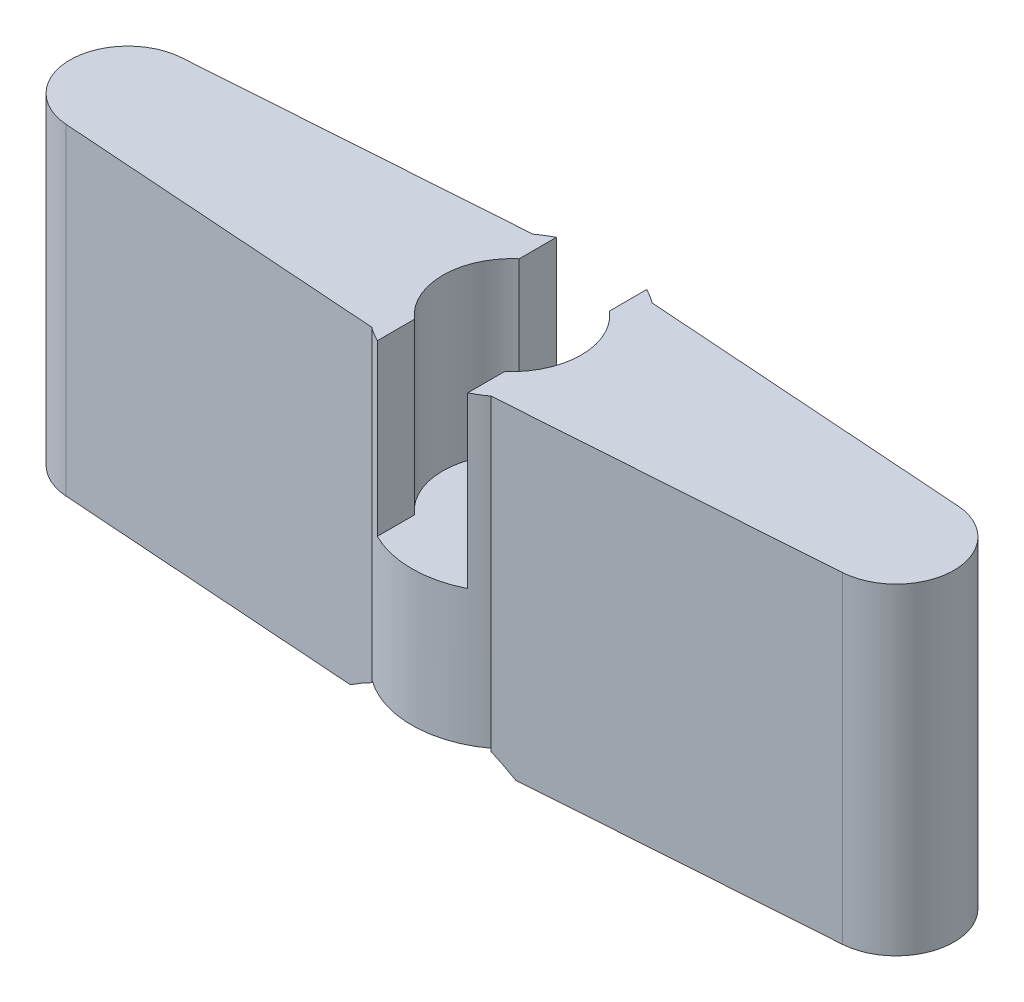
ISO-10303-21;
HEADER;
FILE_DESCRIPTION(('STEP AP214'),'2;1');
FILE_NAME('part.step','',(''),(''),'','','');
FILE_SCHEMA(('AUTOMOTIVE_DESIGN { 1 0 10303 214 1 1 1 1 }'));
ENDSEC;
DATA;
#1=APPLICATION_CONTEXT('core data for automotive mechanical design processes');
#2=APPLICATION_PROTOCOL_DEFINITION('international standard','automotive_design',2000,#1);
#3=PRODUCT_CONTEXT('',#1,'mechanical');
#4=PRODUCT('Part','Part','',(#3));
#5=PRODUCT_RELATED_PRODUCT_CATEGORY('part','',(#4));
#6=PRODUCT_DEFINITION_FORMATION('','',#4);
#7=PRODUCT_DEFINITION_CONTEXT('part definition',#1,'design');
#8=PRODUCT_DEFINITION('design','',#6,#7);
#9=PRODUCT_DEFINITION_SHAPE('','',#8);
#10=(LENGTH_UNIT() NAMED_UNIT(*) SI_UNIT(.MILLI.,.METRE.));
#11=(NAMED_UNIT(*) PLANE_ANGLE_UNIT() SI_UNIT($,.RADIAN.));
#12=(NAMED_UNIT(*) SI_UNIT($,.STERADIAN.) SOLID_ANGLE_UNIT());
#13=UNCERTAINTY_MEASURE_WITH_UNIT(LENGTH_MEASURE(1.E-05),#10,'distance_accuracy_value','');
#14=(GEOMETRIC_REPRESENTATION_CONTEXT(3) GLOBAL_UNCERTAINTY_ASSIGNED_CONTEXT((#13)) GLOBAL_UNIT_ASSIGNED_CONTEXT((#10,
#11,#12)) REPRESENTATION_CONTEXT('',''));
#15=CARTESIAN_POINT('',(0.,0.,0.));
#16=DIRECTION('',(0.,0.,1.));
#17=DIRECTION('',(1.,0.,0.));
#18=AXIS2_PLACEMENT_3D('',#15,#16,#17);
#19=CARTESIAN_POINT('',(-13.6,11.4,0.));
#20=DIRECTION('',(0.,-1.,0.));
#21=DIRECTION('',(0.,0.,-1.));
#22=AXIS2_PLACEMENT_3D('',#19,#20,#21);
#23=PLANE('',#22);
#24=CARTESIAN_POINT('',(0.,11.4,0.));
#25=DIRECTION('',(0.,1.,0.));
#26=DIRECTION('',(0.,0.,1.));
#27=AXIS2_PLACEMENT_3D('',#24,#25,#26);
#28=CIRCLE('',#27,3.55);
#29=CARTESIAN_POINT('',(-2.11206720067856,11.4,2.85336155084101));
#30=VERTEX_POINT('',#29);
#31=CARTESIAN_POINT('',(-1.6,11.4,3.16899037549817));
#32=VERTEX_POINT('',#31);
#33=EDGE_CURVE('E293',#30,#32,#28,.T.);
#34=ORIENTED_EDGE('',*,*,#33,.T.);
#35=DIRECTION('',(0.,0.,1.));
#36=VECTOR('',#35,1.);
#37=CARTESIAN_POINT('',(-1.6,11.4,5.45));
#38=LINE('',#37,#36);
#39=CARTESIAN_POINT('',(-1.6,11.4,1.85539753152795));
#40=VERTEX_POINT('',#39);
#41=EDGE_CURVE('E211',#40,#32,#38,.T.);
#42=ORIENTED_EDGE('',*,*,#41,.F.);
#43=CARTESIAN_POINT('',(0.,11.4,0.));
#44=DIRECTION('',(0.,1.,0.));
#45=DIRECTION('',(0.,0.,1.));
#46=AXIS2_PLACEMENT_3D('',#43,#44,#45);
#47=CIRCLE('',#46,2.45);
#48=CARTESIAN_POINT('',(-1.6,11.4,-1.85539753152795));
#49=VERTEX_POINT('',#48);
#50=EDGE_CURVE('E214',#49,#40,#47,.T.);
#51=ORIENTED_EDGE('',*,*,#50,.F.);
#52=DIRECTION('',(0.,0.,-1.));
#53=VECTOR('',#52,1.);
#54=CARTESIAN_POINT('',(-1.6,11.4,0.));
#55=LINE('',#54,#53);
#56=CARTESIAN_POINT('',(-1.6,11.4,-3.16899037549816));
#57=VERTEX_POINT('',#56);
#58=EDGE_CURVE('E58',#49,#57,#55,.T.);
#59=ORIENTED_EDGE('',*,*,#58,.T.);
#60=CARTESIAN_POINT('',(0.,11.4,0.));
#61=DIRECTION('',(0.,1.,0.));
#62=DIRECTION('',(0.,0.,1.));
#63=AXIS2_PLACEMENT_3D('',#60,#61,#62);
#64=CIRCLE('',#63,3.55);
#65=CARTESIAN_POINT('',(-2.11206720067856,11.4,-2.85336155084101));
#66=VERTEX_POINT('',#65);
#67=EDGE_CURVE('E306',#57,#66,#64,.T.);
#68=ORIENTED_EDGE('',*,*,#67,.T.);
#69=DIRECTION('',(-0.997593558445748,0.,0.0693331965767428));
#70=VECTOR('',#69,1.);
#71=CARTESIAN_POINT('',(-13.7421330529823,11.4,-2.04506679481378));
#72=LINE('',#71,#70);
#73=CARTESIAN_POINT('',(-13.7421330529823,11.4,-2.04506679481378));
#74=VERTEX_POINT('',#73);
#75=EDGE_CURVE('E311',#66,#74,#72,.T.);
#76=ORIENTED_EDGE('',*,*,#75,.T.);
#77=CARTESIAN_POINT('',(-13.6,11.4,0.));
#78=DIRECTION('',(0.,1.,0.));
#79=DIRECTION('',(0.,0.,-1.));
#80=AXIS2_PLACEMENT_3D('',#77,#78,#79);
#81=CIRCLE('',#80,2.05);
#82=CARTESIAN_POINT('',(-13.7421330529823,11.4,2.04506679481379));
#83=VERTEX_POINT('',#82);
#84=EDGE_CURVE('E284',#74,#83,#81,.T.);
#85=ORIENTED_EDGE('',*,*,#84,.T.);
#86=DIRECTION('',(0.997593558445748,0.,0.0693331965767427));
#87=VECTOR('',#86,1.);
#88=CARTESIAN_POINT('',(-13.7421330529823,11.4,2.04506679481379));
#89=LINE('',#88,#87);
#90=EDGE_CURVE('E288',#83,#30,#89,.T.);
#91=ORIENTED_EDGE('',*,*,#90,.T.);
#92=EDGE_LOOP('',(#34,#42,#51,#59,#68,#76,#85,#91));
#93=FACE_BOUND('',#92,.T.);
#94=ADVANCED_FACE('F47',(#93),#23,.F.);
#95=CARTESIAN_POINT('',(0.,11.4,0.));
#96=DIRECTION('',(0.,-1.,0.));
#97=DIRECTION('',(0.,0.,-1.));
#98=AXIS2_PLACEMENT_3D('',#95,#96,#97);
#99=CYLINDRICAL_SURFACE('',#98,3.55);
#100=CARTESIAN_POINT('',(1.6,11.4,3.16899037549817));
#101=VERTEX_POINT('',#100);
#102=CARTESIAN_POINT('',(2.11206720067856,11.4,2.85336155084101));
#103=VERTEX_POINT('',#102);
#104=EDGE_CURVE('E292',#101,#103,#28,.T.);
#105=ORIENTED_EDGE('',*,*,#104,.F.);
#106=DIRECTION('',(0.,-1.,0.));
#107=VECTOR('',#106,1.);
#108=CARTESIAN_POINT('',(1.6,11.4,3.16899037549817));
#109=LINE('',#108,#107);
#110=CARTESIAN_POINT('',(1.6,5.4,3.16899037549817));
#111=VERTEX_POINT('',#110);
#112=EDGE_CURVE('E256',#101,#111,#109,.T.);
#113=ORIENTED_EDGE('',*,*,#112,.T.);
#114=CARTESIAN_POINT('',(0.,5.4,0.));
#115=DIRECTION('',(0.,1.,0.));
#116=DIRECTION('',(0.,0.,1.));
#117=AXIS2_PLACEMENT_3D('',#114,#115,#116);
#118=CIRCLE('',#117,3.55);
#119=CARTESIAN_POINT('',(-1.6,5.4,3.16899037549817));
#120=VERTEX_POINT('',#119);
#121=EDGE_CURVE('E260',#120,#111,#118,.T.);
#122=ORIENTED_EDGE('',*,*,#121,.F.);
#123=DIRECTION('',(0.,-1.,0.));
#124=VECTOR('',#123,1.);
#125=CARTESIAN_POINT('',(-1.6,11.4,3.16899037549817));
#126=LINE('',#125,#124);
#127=EDGE_CURVE('E252',#120,#32,#126,.F.);
#128=ORIENTED_EDGE('',*,*,#127,.T.);
#129=ORIENTED_EDGE('',*,*,#33,.F.);
#130=DIRECTION('',(0.,-1.,0.));
#131=VECTOR('',#130,1.);
#132=CARTESIAN_POINT('',(-2.11206720067856,11.4,2.85336155084101));
#133=LINE('',#132,#131);
#134=CARTESIAN_POINT('',(-2.11206720067856,0.6,2.85336155084101));
#135=VERTEX_POINT('',#134);
#136=EDGE_CURVE('E356',#30,#135,#133,.T.);
#137=ORIENTED_EDGE('',*,*,#136,.T.);
#138=CARTESIAN_POINT('',(0.,0.6,0.));
#139=DIRECTION('',(0.,-1.,0.));
#140=DIRECTION('',(0.,0.,-1.));
#141=AXIS2_PLACEMENT_3D('',#138,#139,#140);
#142=CIRCLE('',#141,3.55);
#143=CARTESIAN_POINT('',(2.11206720067856,0.6,2.85336155084101));
#144=VERTEX_POINT('',#143);
#145=EDGE_CURVE('E269',#144,#135,#142,.T.);
#146=ORIENTED_EDGE('',*,*,#145,.F.);
#147=DIRECTION('',(0.,-1.,0.));
#148=VECTOR('',#147,1.);
#149=CARTESIAN_POINT('',(2.11206720067856,11.4,2.85336155084101));
#150=LINE('',#149,#148);
#151=EDGE_CURVE('E352',#103,#144,#150,.T.);
#152=ORIENTED_EDGE('',*,*,#151,.F.);
#153=EDGE_LOOP('',(#105,#113,#122,#128,#129,#137,#146,#152));
#154=FACE_BOUND('',#153,.T.);
#155=ADVANCED_FACE('F391',(#154),#99,.T.);
#156=CARTESIAN_POINT('',(0.,11.4,0.));
#157=DIRECTION('',(0.,-1.,0.));
#158=DIRECTION('',(0.,0.,-1.));
#159=AXIS2_PLACEMENT_3D('',#156,#157,#158);
#160=CYLINDRICAL_SURFACE('',#159,3.55);
#161=ORIENTED_EDGE('',*,*,#67,.F.);
#162=DIRECTION('',(0.,-1.,0.));
#163=VECTOR('',#162,1.);
#164=CARTESIAN_POINT('',(-1.6,11.4,-3.16899037549816));
#165=LINE('',#164,#163);
#166=CARTESIAN_POINT('',(-1.6,5.4,-3.16899037549816));
#167=VERTEX_POINT('',#166);
#168=EDGE_CURVE('E248',#57,#167,#165,.T.);
#169=ORIENTED_EDGE('',*,*,#168,.T.);
#170=CARTESIAN_POINT('',(0.,5.4,0.));
#171=DIRECTION('',(0.,1.,0.));
#172=DIRECTION('',(0.,0.,1.));
#173=AXIS2_PLACEMENT_3D('',#170,#171,#172);
#174=CIRCLE('',#173,3.55);
#175=CARTESIAN_POINT('',(1.6,5.4,-3.16899037549817));
#176=VERTEX_POINT('',#175);
#177=EDGE_CURVE('E11',#176,#167,#174,.T.);
#178=ORIENTED_EDGE('',*,*,#177,.F.);
#179=DIRECTION('',(0.,-1.,0.));
#180=VECTOR('',#179,1.);
#181=CARTESIAN_POINT('',(1.6,11.4,-3.16899037549817));
#182=LINE('',#181,#180);
#183=CARTESIAN_POINT('',(1.6,11.4,-3.16899037549817));
#184=VERTEX_POINT('',#183);
#185=EDGE_CURVE('E201',#176,#184,#182,.F.);
#186=ORIENTED_EDGE('',*,*,#185,.T.);
#187=CARTESIAN_POINT('',(2.11206720067856,11.4,-2.85336155084101));
#188=VERTEX_POINT('',#187);
#189=EDGE_CURVE('E307',#188,#184,#64,.T.);
#190=ORIENTED_EDGE('',*,*,#189,.F.);
#191=DIRECTION('',(0.,-1.,0.));
#192=VECTOR('',#191,1.);
#193=CARTESIAN_POINT('',(2.11206720067856,11.4,-2.85336155084101));
#194=LINE('',#193,#192);
#195=CARTESIAN_POINT('',(2.11206720067856,0.6,-2.85336155084101));
#196=VERTEX_POINT('',#195);
#197=EDGE_CURVE('E340',#188,#196,#194,.T.);
#198=ORIENTED_EDGE('',*,*,#197,.T.);
#199=CARTESIAN_POINT('',(-2.11206720067856,0.6,-2.85336155084101));
#200=VERTEX_POINT('',#199);
#201=EDGE_CURVE('E263',#200,#196,#142,.T.);
#202=ORIENTED_EDGE('',*,*,#201,.F.);
#203=DIRECTION('',(0.,-1.,0.));
#204=VECTOR('',#203,1.);
#205=CARTESIAN_POINT('',(-2.11206720067856,11.4,-2.85336155084101));
#206=LINE('',#205,#204);
#207=EDGE_CURVE('E336',#66,#200,#206,.T.);
#208=ORIENTED_EDGE('',*,*,#207,.F.);
#209=EDGE_LOOP('',(#161,#169,#178,#186,#190,#198,#202,#208));
#210=FACE_BOUND('',#209,.T.);
#211=ADVANCED_FACE('F394',(#210),#160,.T.);
#212=CARTESIAN_POINT('',(-13.6,0.,0.));
#213=DIRECTION('',(0.,-1.,0.));
#214=DIRECTION('',(0.,0.,-1.));
#215=AXIS2_PLACEMENT_3D('',#212,#213,#214);
#216=PLANE('',#215);
#217=DIRECTION('',(0.997593558445748,0.,-0.0693331965767425));
#218=VECTOR('',#217,1.);
#219=CARTESIAN_POINT('',(13.7421330529823,0.,2.04506679481379));
#220=LINE('',#219,#218);
#221=CARTESIAN_POINT('',(2.92947075894018,0.,2.79655163952224));
#222=VERTEX_POINT('',#221);
#223=CARTESIAN_POINT('',(13.7421330529823,0.,2.04506679481379));
#224=VERTEX_POINT('',#223);
#225=EDGE_CURVE('E321',#222,#224,#220,.T.);
#226=ORIENTED_EDGE('',*,*,#225,.F.);
#227=CARTESIAN_POINT('',(0.,0.,0.));
#228=DIRECTION('',(0.,-1.,0.));
#229=DIRECTION('',(0.,0.,-1.));
#230=AXIS2_PLACEMENT_3D('',#227,#228,#229);
#231=CIRCLE('',#230,4.05000000000001);
#232=CARTESIAN_POINT('',(2.92947075894018,0.,-2.79655163952224));
#233=VERTEX_POINT('',#232);
#234=EDGE_CURVE('E376',#222,#233,#231,.F.);
#235=ORIENTED_EDGE('',*,*,#234,.T.);
#236=DIRECTION('',(-0.997593558445748,0.,-0.0693331965767422));
#237=VECTOR('',#236,1.);
#238=CARTESIAN_POINT('',(13.7421330529823,0.,-2.04506679481379));
#239=LINE('',#238,#237);
#240=CARTESIAN_POINT('',(13.7421330529823,0.,-2.04506679481379));
#241=VERTEX_POINT('',#240);
#242=EDGE_CURVE('E327',#241,#233,#239,.T.);
#243=ORIENTED_EDGE('',*,*,#242,.F.);
#244=CARTESIAN_POINT('',(13.6,0.,0.));
#245=DIRECTION('',(0.,1.,0.));
#246=DIRECTION('',(0.,0.,1.));
#247=AXIS2_PLACEMENT_3D('',#244,#245,#246);
#248=CIRCLE('',#247,2.05000000000001);
#249=EDGE_CURVE('E324',#224,#241,#248,.T.);
#250=ORIENTED_EDGE('',*,*,#249,.F.);
#251=EDGE_LOOP('',(#226,#235,#243,#250));
#252=FACE_BOUND('',#251,.T.);
#253=ADVANCED_FACE('F470',(#252),#216,.T.);
#254=CARTESIAN_POINT('',(-13.6,11.4,0.));
#255=DIRECTION('',(0.,-1.,0.));
#256=DIRECTION('',(0.,0.,-1.));
#257=AXIS2_PLACEMENT_3D('',#254,#255,#256);
#258=CYLINDRICAL_SURFACE('',#257,2.05);
#259=CARTESIAN_POINT('',(-13.6,0.,0.));
#260=DIRECTION('',(0.,1.,0.));
#261=DIRECTION('',(0.,0.,-1.));
#262=AXIS2_PLACEMENT_3D('',#259,#260,#261);
#263=CIRCLE('',#262,2.05);
#264=CARTESIAN_POINT('',(-13.7421330529823,0.,-2.04506679481378));
#265=VERTEX_POINT('',#264);
#266=CARTESIAN_POINT('',(-13.7421330529823,0.,2.04506679481379));
#267=VERTEX_POINT('',#266);
#268=EDGE_CURVE('E283',#265,#267,#263,.T.);
#269=ORIENTED_EDGE('',*,*,#268,.T.);
#270=DIRECTION('',(0.,-1.,0.));
#271=VECTOR('',#270,1.);
#272=CARTESIAN_POINT('',(-13.7421330529823,11.4,2.04506679481379));
#273=LINE('',#272,#271);
#274=EDGE_CURVE('E360',#83,#267,#273,.T.);
#275=ORIENTED_EDGE('',*,*,#274,.F.);
#276=ORIENTED_EDGE('',*,*,#84,.F.);
#277=DIRECTION('',(0.,-1.,0.));
#278=VECTOR('',#277,1.);
#279=CARTESIAN_POINT('',(-13.7421330529823,11.4,-2.04506679481378));
#280=LINE('',#279,#278);
#281=EDGE_CURVE('E314',#74,#265,#280,.T.);
#282=ORIENTED_EDGE('',*,*,#281,.T.);
#283=EDGE_LOOP('',(#269,#275,#276,#282));
#284=FACE_BOUND('',#283,.T.);
#285=ADVANCED_FACE('F398',(#284),#258,.T.);
#286=CARTESIAN_POINT('',(-13.7421330529823,11.4,2.04506679481379));
#287=DIRECTION('',(0.0693331965767427,0.,-0.997593558445748));
#288=DIRECTION('',(-0.997593558445748,0.,-0.0693331965767427));
#289=AXIS2_PLACEMENT_3D('',#286,#287,#288);
#290=PLANE('',#289);
#291=DIRECTION('',(0.997593558445748,0.,0.0693331965767427));
#292=VECTOR('',#291,1.);
#293=CARTESIAN_POINT('',(-13.7421330529823,0.,2.04506679481379));
#294=LINE('',#293,#292);
#295=CARTESIAN_POINT('',(-2.92947075894019,0.,2.79655163952224));
#296=VERTEX_POINT('',#295);
#297=EDGE_CURVE('E318',#267,#296,#294,.T.);
#298=ORIENTED_EDGE('',*,*,#297,.T.);
#299=CARTESIAN_POINT('',(-2.92947075894018,0.,2.79655163952224));
#300=CARTESIAN_POINT('',(-2.86324704905432,0.0447155819520324,2.80115421685114));
#301=CARTESIAN_POINT('',(-2.79661425008659,0.0888313173042009,2.80578522605341));
#302=CARTESIAN_POINT('',(-2.66246979131271,0.175605977431229,2.81510832567761));
#303=CARTESIAN_POINT('',(-2.59495869203381,0.218265773901589,2.81980037714265));
#304=CARTESIAN_POINT('',(-2.4589080154176,0.301931709302118,2.8292559597558));
#305=CARTESIAN_POINT('',(-2.39036831150441,0.342937642386836,2.83401949970099));
#306=CARTESIAN_POINT('',(-2.25211578578016,0.423008838841666,2.84362811180771));
#307=CARTESIAN_POINT('',(-2.18240227306905,0.462072901679901,2.8484732319871));
#308=CARTESIAN_POINT('',(-2.11206720067856,0.50000000000001,2.85336155084101));
#309=B_SPLINE_CURVE_WITH_KNOTS('',3,(#299,#300,#301,#302,#303,#304,#305,#306,#307,#308),
.UNSPECIFIED.,.F.,.F.,(4,2,2,2,4),(0.,0.240120930713615,0.480095480675951,0.720099807089992,
0.960250712770563),.UNSPECIFIED.);
#310=CARTESIAN_POINT('',(-2.11206720067856,0.50000000000001,2.85336155084101));
#311=VERTEX_POINT('',#310);
#312=EDGE_CURVE('E401',#296,#311,#309,.T.);
#313=ORIENTED_EDGE('',*,*,#312,.T.);
#314=DIRECTION('',(0.,-1.,0.));
#315=VECTOR('',#314,1.);
#316=CARTESIAN_POINT('',(-2.11206720067856,0.6,2.85336155084101));
#317=LINE('',#316,#315);
#318=EDGE_CURVE('E280',#311,#135,#317,.F.);
#319=ORIENTED_EDGE('',*,*,#318,.T.);
#320=ORIENTED_EDGE('',*,*,#136,.F.);
#321=ORIENTED_EDGE('',*,*,#90,.F.);
#322=ORIENTED_EDGE('',*,*,#274,.T.);
#323=EDGE_LOOP('',(#298,#313,#319,#320,#321,#322));
#324=FACE_BOUND('',#323,.T.);
#325=ADVANCED_FACE('F388',(#324),#290,.F.);
#326=CARTESIAN_POINT('',(13.7421330529823,11.4,2.04506679481379));
#327=DIRECTION('',(-0.0693331965767425,0.,-0.997593558445748));
#328=DIRECTION('',(-0.997593558445748,0.,0.0693331965767425));
#329=AXIS2_PLACEMENT_3D('',#326,#327,#328);
#330=PLANE('',#329);
#331=DIRECTION('',(0.,-1.,0.));
#332=VECTOR('',#331,1.);
#333=CARTESIAN_POINT('',(2.11206720067856,0.6,2.85336155084101));
#334=LINE('',#333,#332);
#335=CARTESIAN_POINT('',(2.11206720067856,0.50000000000001,2.85336155084101));
#336=VERTEX_POINT('',#335);
#337=EDGE_CURVE('E276',#144,#336,#334,.T.);
#338=ORIENTED_EDGE('',*,*,#337,.T.);
#339=CARTESIAN_POINT('',(2.11206720067856,0.50000000000001,2.85336155084101));
#340=CARTESIAN_POINT('',(2.18240227306905,0.462072901679901,2.8484732319871));
#341=CARTESIAN_POINT('',(2.25211578578016,0.423008838841666,2.84362811180771));
#342=CARTESIAN_POINT('',(2.39036831150441,0.342937642386836,2.83401949970099));
#343=CARTESIAN_POINT('',(2.4589080154176,0.301931709302118,2.8292559597558));
#344=CARTESIAN_POINT('',(2.59495869203381,0.218265773901588,2.81980037714265));
#345=CARTESIAN_POINT('',(2.66246979131271,0.175605977431229,2.81510832567761));
#346=CARTESIAN_POINT('',(2.79661425008659,0.0888313173042005,2.80578522605341));
#347=CARTESIAN_POINT('',(2.86324704905432,0.0447155819520321,2.80115421685114));
#348=CARTESIAN_POINT('',(2.92947075894018,0.,2.79655163952224));
#349=B_SPLINE_CURVE_WITH_KNOTS('',3,(#339,#340,#341,#342,#343,#344,#345,#346,#347,#348),
.UNSPECIFIED.,.F.,.F.,(4,2,2,2,4),(0.,0.240150905680571,0.480155232094612,0.720129782056947,
0.960250712770562),.UNSPECIFIED.);
#350=EDGE_CURVE('E368',#336,#222,#349,.T.);
#351=ORIENTED_EDGE('',*,*,#350,.T.);
#352=ORIENTED_EDGE('',*,*,#225,.T.);
#353=DIRECTION('',(0.,-1.,0.));
#354=VECTOR('',#353,1.);
#355=CARTESIAN_POINT('',(13.7421330529823,11.4,2.04506679481379));
#356=LINE('',#355,#354);
#357=CARTESIAN_POINT('',(13.7421330529823,11.4,2.04506679481379));
#358=VERTEX_POINT('',#357);
#359=EDGE_CURVE('E348',#358,#224,#356,.T.);
#360=ORIENTED_EDGE('',*,*,#359,.F.);
#361=DIRECTION('',(0.997593558445748,0.,-0.0693331965767425));
#362=VECTOR('',#361,1.);
#363=CARTESIAN_POINT('',(13.7421330529823,11.4,2.04506679481379));
#364=LINE('',#363,#362);
#365=EDGE_CURVE('E297',#103,#358,#364,.T.);
#366=ORIENTED_EDGE('',*,*,#365,.F.);
#367=ORIENTED_EDGE('',*,*,#151,.T.);
#368=EDGE_LOOP('',(#338,#351,#352,#360,#366,#367));
#369=FACE_BOUND('',#368,.T.);
#370=ADVANCED_FACE('F382',(#369),#330,.F.);
#371=CARTESIAN_POINT('',(13.6,11.4,0.));
#372=DIRECTION('',(0.,-1.,0.));
#373=DIRECTION('',(0.,0.,-1.));
#374=AXIS2_PLACEMENT_3D('',#371,#372,#373);
#375=CYLINDRICAL_SURFACE('',#374,2.05000000000001);
#376=ORIENTED_EDGE('',*,*,#249,.T.);
#377=DIRECTION('',(0.,-1.,0.));
#378=VECTOR('',#377,1.);
#379=CARTESIAN_POINT('',(13.7421330529823,11.4,-2.04506679481379));
#380=LINE('',#379,#378);
#381=CARTESIAN_POINT('',(13.7421330529823,11.4,-2.04506679481379));
#382=VERTEX_POINT('',#381);
#383=EDGE_CURVE('E344',#382,#241,#380,.T.);
#384=ORIENTED_EDGE('',*,*,#383,.F.);
#385=CARTESIAN_POINT('',(13.6,11.4,0.));
#386=DIRECTION('',(0.,1.,0.));
#387=DIRECTION('',(0.,0.,1.));
#388=AXIS2_PLACEMENT_3D('',#385,#386,#387);
#389=CIRCLE('',#388,2.05000000000001);
#390=EDGE_CURVE('E300',#358,#382,#389,.T.);
#391=ORIENTED_EDGE('',*,*,#390,.F.);
#392=ORIENTED_EDGE('',*,*,#359,.T.);
#393=EDGE_LOOP('',(#376,#384,#391,#392));
#394=FACE_BOUND('',#393,.T.);
#395=ADVANCED_FACE('F387',(#394),#375,.T.);
#396=CARTESIAN_POINT('',(13.7421330529823,11.4,-2.04506679481379));
#397=DIRECTION('',(-0.0693331965767422,0.,0.997593558445748));
#398=DIRECTION('',(0.997593558445748,0.,0.0693331965767422));
#399=AXIS2_PLACEMENT_3D('',#396,#397,#398);
#400=PLANE('',#399);
#401=ORIENTED_EDGE('',*,*,#242,.T.);
#402=CARTESIAN_POINT('',(2.92947075894018,0.,-2.79655163952224));
#403=CARTESIAN_POINT('',(2.86324704905432,0.0447155819520325,-2.80115421685114));
#404=CARTESIAN_POINT('',(2.79661425008659,0.088831317304201,-2.80578522605341));
#405=CARTESIAN_POINT('',(2.66246979131271,0.175605977431229,-2.81510832567761));
#406=CARTESIAN_POINT('',(2.59495869203381,0.218265773901589,-2.81980037714265));
#407=CARTESIAN_POINT('',(2.4589080154176,0.301931709302118,-2.8292559597558));
#408=CARTESIAN_POINT('',(2.39036831150441,0.342937642386836,-2.83401949970099));
#409=CARTESIAN_POINT('',(2.25211578578016,0.423008838841666,-2.84362811180771));
#410=CARTESIAN_POINT('',(2.18240227306905,0.4620729016799,-2.8484732319871));
#411=CARTESIAN_POINT('',(2.11206720067856,0.500000000000009,-2.85336155084101));
#412=B_SPLINE_CURVE_WITH_KNOTS('',3,(#402,#403,#404,#405,#406,#407,#408,#409,#410,#411),
.UNSPECIFIED.,.F.,.F.,(4,2,2,2,4),(0.,0.240120930713614,0.48009548067595,0.72009980708999,
0.960250712770561),.UNSPECIFIED.);
#413=CARTESIAN_POINT('',(2.11206720067856,0.50000000000001,-2.85336155084101));
#414=VERTEX_POINT('',#413);
#415=EDGE_CURVE('E449',#233,#414,#412,.T.);
#416=ORIENTED_EDGE('',*,*,#415,.T.);
#417=DIRECTION('',(0.,-1.,0.));
#418=VECTOR('',#417,1.);
#419=CARTESIAN_POINT('',(2.11206720067856,0.6,-2.85336155084101));
#420=LINE('',#419,#418);
#421=EDGE_CURVE('E273',#414,#196,#420,.F.);
#422=ORIENTED_EDGE('',*,*,#421,.T.);
#423=ORIENTED_EDGE('',*,*,#197,.F.);
#424=DIRECTION('',(-0.997593558445748,0.,-0.0693331965767422));
#425=VECTOR('',#424,1.);
#426=CARTESIAN_POINT('',(13.7421330529823,11.4,-2.04506679481379));
#427=LINE('',#426,#425);
#428=EDGE_CURVE('E303',#382,#188,#427,.T.);
#429=ORIENTED_EDGE('',*,*,#428,.F.);
#430=ORIENTED_EDGE('',*,*,#383,.T.);
#431=EDGE_LOOP('',(#401,#416,#422,#423,#429,#430));
#432=FACE_BOUND('',#431,.T.);
#433=ADVANCED_FACE('F447',(#432),#400,.F.);
#434=CARTESIAN_POINT('',(-13.7421330529823,11.4,-2.04506679481378));
#435=DIRECTION('',(0.0693331965767428,0.,0.997593558445748));
#436=DIRECTION('',(0.997593558445748,0.,-0.0693331965767428));
#437=AXIS2_PLACEMENT_3D('',#434,#435,#436);
#438=PLANE('',#437);
#439=DIRECTION('',(0.,-1.,0.));
#440=VECTOR('',#439,1.);
#441=CARTESIAN_POINT('',(-2.11206720067856,0.6,-2.85336155084101));
#442=LINE('',#441,#440);
#443=CARTESIAN_POINT('',(-2.11206720067856,0.50000000000001,-2.85336155084101));
#444=VERTEX_POINT('',#443);
#445=EDGE_CURVE('E268',#200,#444,#442,.T.);
#446=ORIENTED_EDGE('',*,*,#445,.T.);
#447=CARTESIAN_POINT('',(-2.11206720067857,0.50000000000001,-2.85336155084101));
#448=CARTESIAN_POINT('',(-2.18240227306906,0.462072901679901,-2.8484732319871));
#449=CARTESIAN_POINT('',(-2.25211578578016,0.423008838841666,-2.84362811180771));
#450=CARTESIAN_POINT('',(-2.39036831150441,0.342937642386836,-2.83401949970099));
#451=CARTESIAN_POINT('',(-2.4589080154176,0.301931709302118,-2.82925595975579));
#452=CARTESIAN_POINT('',(-2.59495869203381,0.218265773901589,-2.81980037714264));
#453=CARTESIAN_POINT('',(-2.66246979131271,0.175605977431229,-2.81510832567761));
#454=CARTESIAN_POINT('',(-2.79661425008659,0.0888313173042004,-2.80578522605341));
#455=CARTESIAN_POINT('',(-2.86324704905432,0.0447155819520319,-2.80115421685114));
#456=CARTESIAN_POINT('',(-2.92947075894018,0.,-2.79655163952224));
#457=B_SPLINE_CURVE_WITH_KNOTS('',3,(#447,#448,#449,#450,#451,#452,#453,#454,#455,#456),
.UNSPECIFIED.,.F.,.F.,(4,2,2,2,4),(0.,0.240150905680571,0.480155232094612,0.720129782056948,
0.960250712770562),.UNSPECIFIED.);
#458=CARTESIAN_POINT('',(-2.92947075894019,0.,-2.79655163952224));
#459=VERTEX_POINT('',#458);
#460=EDGE_CURVE('E458',#444,#459,#457,.T.);
#461=ORIENTED_EDGE('',*,*,#460,.T.);
#462=DIRECTION('',(-0.997593558445748,0.,0.0693331965767428));
#463=VECTOR('',#462,1.);
#464=CARTESIAN_POINT('',(-13.7421330529823,0.,-2.04506679481378));
#465=LINE('',#464,#463);
#466=EDGE_CURVE('E289',#459,#265,#465,.T.);
#467=ORIENTED_EDGE('',*,*,#466,.T.);
#468=ORIENTED_EDGE('',*,*,#281,.F.);
#469=ORIENTED_EDGE('',*,*,#75,.F.);
#470=ORIENTED_EDGE('',*,*,#207,.T.);
#471=EDGE_LOOP('',(#446,#461,#467,#468,#469,#470));
#472=FACE_BOUND('',#471,.T.);
#473=ADVANCED_FACE('F467',(#472),#438,.F.);
#474=CARTESIAN_POINT('',(0.,11.4,0.));
#475=DIRECTION('',(0.,1.,0.));
#476=DIRECTION('',(0.,0.,1.));
#477=AXIS2_PLACEMENT_3D('',#474,#475,#476);
#478=CIRCLE('',#477,2.45);
#479=CARTESIAN_POINT('',(1.6,11.4,1.85539753152795));
#480=VERTEX_POINT('',#479);
#481=CARTESIAN_POINT('',(1.6,11.4,-1.85539753152795));
#482=VERTEX_POINT('',#481);
#483=EDGE_CURVE('E65',#480,#482,#478,.T.);
#484=ORIENTED_EDGE('',*,*,#483,.F.);
#485=DIRECTION('',(0.,0.,1.));
#486=VECTOR('',#485,1.);
#487=CARTESIAN_POINT('',(1.6,11.4,0.));
#488=LINE('',#487,#486);
#489=EDGE_CURVE('E409',#480,#101,#488,.T.);
#490=ORIENTED_EDGE('',*,*,#489,.T.);
#491=ORIENTED_EDGE('',*,*,#104,.T.);
#492=ORIENTED_EDGE('',*,*,#365,.T.);
#493=ORIENTED_EDGE('',*,*,#390,.T.);
#494=ORIENTED_EDGE('',*,*,#428,.T.);
#495=ORIENTED_EDGE('',*,*,#189,.T.);
#496=DIRECTION('',(0.,0.,-1.));
#497=VECTOR('',#496,1.);
#498=CARTESIAN_POINT('',(1.6,11.4,-1.85539753152795));
#499=LINE('',#498,#497);
#500=EDGE_CURVE('E231',#482,#184,#499,.T.);
#501=ORIENTED_EDGE('',*,*,#500,.F.);
#502=EDGE_LOOP('',(#484,#490,#491,#492,#493,#494,#495,#501));
#503=FACE_BOUND('',#502,.T.);
#504=ADVANCED_FACE('F474',(#503),#23,.F.);
#505=ORIENTED_EDGE('',*,*,#466,.F.);
#506=CARTESIAN_POINT('',(0.,0.,0.));
#507=DIRECTION('',(0.,-1.,0.));
#508=DIRECTION('',(0.,0.,-1.));
#509=AXIS2_PLACEMENT_3D('',#506,#507,#508);
#510=CIRCLE('',#509,4.05000000000001);
#511=EDGE_CURVE('E73',#459,#296,#510,.F.);
#512=ORIENTED_EDGE('',*,*,#511,.T.);
#513=ORIENTED_EDGE('',*,*,#297,.F.);
#514=ORIENTED_EDGE('',*,*,#268,.F.);
#515=EDGE_LOOP('',(#505,#512,#513,#514));
#516=FACE_BOUND('',#515,.T.);
#517=ADVANCED_FACE('F476',(#516),#216,.T.);
#518=CARTESIAN_POINT('',(0.,0.6,0.));
#519=DIRECTION('',(0.,-1.,0.));
#520=DIRECTION('',(0.,0.,-1.));
#521=AXIS2_PLACEMENT_3D('',#518,#519,#520);
#522=CYLINDRICAL_SURFACE('',#521,3.55);
#523=ORIENTED_EDGE('',*,*,#318,.F.);
#524=CARTESIAN_POINT('',(0.,0.50000000000001,0.));
#525=DIRECTION('',(0.,-1.,0.));
#526=DIRECTION('',(0.,0.,-1.));
#527=AXIS2_PLACEMENT_3D('',#524,#525,#526);
#528=CIRCLE('',#527,3.55);
#529=EDGE_CURVE('E454',#311,#444,#528,.T.);
#530=ORIENTED_EDGE('',*,*,#529,.T.);
#531=ORIENTED_EDGE('',*,*,#445,.F.);
#532=EDGE_CURVE('E430',#135,#200,#142,.T.);
#533=ORIENTED_EDGE('',*,*,#532,.F.);
#534=EDGE_LOOP('',(#523,#530,#531,#533));
#535=FACE_BOUND('',#534,.T.);
#536=ADVANCED_FACE('F492',(#535),#522,.F.);
#537=ORIENTED_EDGE('',*,*,#421,.F.);
#538=CARTESIAN_POINT('',(0.,0.50000000000001,0.));
#539=DIRECTION('',(0.,-1.,0.));
#540=DIRECTION('',(0.,0.,-1.));
#541=AXIS2_PLACEMENT_3D('',#538,#539,#540);
#542=CIRCLE('',#541,3.55);
#543=EDGE_CURVE('E364',#414,#336,#542,.T.);
#544=ORIENTED_EDGE('',*,*,#543,.T.);
#545=ORIENTED_EDGE('',*,*,#337,.F.);
#546=EDGE_CURVE('E264',#196,#144,#142,.T.);
#547=ORIENTED_EDGE('',*,*,#546,.F.);
#548=EDGE_LOOP('',(#537,#544,#545,#547));
#549=FACE_BOUND('',#548,.T.);
#550=ADVANCED_FACE('F441',(#549),#522,.F.);
#551=CARTESIAN_POINT('',(0.,0.6,0.));
#552=DIRECTION('',(0.,-1.,0.));
#553=DIRECTION('',(0.,0.,-1.));
#554=AXIS2_PLACEMENT_3D('',#551,#552,#553);
#555=PLANE('',#554);
#556=ORIENTED_EDGE('',*,*,#546,.T.);
#557=ORIENTED_EDGE('',*,*,#145,.T.);
#558=ORIENTED_EDGE('',*,*,#532,.T.);
#559=ORIENTED_EDGE('',*,*,#201,.T.);
#560=EDGE_LOOP('',(#556,#557,#558,#559));
#561=FACE_BOUND('',#560,.T.);
#562=ADVANCED_FACE('F436',(#561),#555,.T.);
#563=CARTESIAN_POINT('',(0.,0.50000000000001,0.));
#564=DIRECTION('',(0.,-1.,0.));
#565=DIRECTION('',(0.,0.,-1.));
#566=AXIS2_PLACEMENT_3D('',#563,#564,#565);
#567=CONICAL_SURFACE('',#566,3.55,0.78539816339745);
#568=ORIENTED_EDGE('',*,*,#415,.F.);
#569=ORIENTED_EDGE('',*,*,#234,.F.);
#570=ORIENTED_EDGE('',*,*,#350,.F.);
#571=ORIENTED_EDGE('',*,*,#543,.F.);
#572=EDGE_LOOP('',(#568,#569,#570,#571));
#573=FACE_BOUND('',#572,.T.);
#574=ADVANCED_FACE('F379',(#573),#567,.F.);
#575=CARTESIAN_POINT('',(0.,0.50000000000001,0.));
#576=DIRECTION('',(0.,-1.,0.));
#577=DIRECTION('',(0.,0.,-1.));
#578=AXIS2_PLACEMENT_3D('',#575,#576,#577);
#579=CONICAL_SURFACE('',#578,3.55,0.78539816339745);
#580=ORIENTED_EDGE('',*,*,#312,.F.);
#581=ORIENTED_EDGE('',*,*,#511,.F.);
#582=ORIENTED_EDGE('',*,*,#460,.F.);
#583=ORIENTED_EDGE('',*,*,#529,.F.);
#584=EDGE_LOOP('',(#580,#581,#582,#583));
#585=FACE_BOUND('',#584,.T.);
#586=ADVANCED_FACE('F50',(#585),#579,.F.);
#587=CARTESIAN_POINT('',(0.,5.4,0.));
#588=DIRECTION('',(0.,1.,0.));
#589=DIRECTION('',(0.,0.,1.));
#590=AXIS2_PLACEMENT_3D('',#587,#588,#589);
#591=PLANE('',#590);
#592=ORIENTED_EDGE('',*,*,#121,.T.);
#593=DIRECTION('',(0.,0.,-1.));
#594=VECTOR('',#593,1.);
#595=CARTESIAN_POINT('',(1.6,5.4,1.85539753152795));
#596=LINE('',#595,#594);
#597=CARTESIAN_POINT('',(1.6,5.4,1.85539753152795));
#598=VERTEX_POINT('',#597);
#599=EDGE_CURVE('E195',#111,#598,#596,.T.);
#600=ORIENTED_EDGE('',*,*,#599,.T.);
#601=CARTESIAN_POINT('',(0.,5.4,0.));
#602=DIRECTION('',(0.,1.,0.));
#603=DIRECTION('',(0.,0.,1.));
#604=AXIS2_PLACEMENT_3D('',#601,#602,#603);
#605=CIRCLE('',#604,2.45);
#606=CARTESIAN_POINT('',(1.6,5.4,-1.85539753152795));
#607=VERTEX_POINT('',#606);
#608=EDGE_CURVE('E190',#598,#607,#605,.T.);
#609=ORIENTED_EDGE('',*,*,#608,.T.);
#610=DIRECTION('',(0.,0.,-1.));
#611=VECTOR('',#610,1.);
#612=CARTESIAN_POINT('',(1.6,5.4,-1.85539753152795));
#613=LINE('',#612,#611);
#614=EDGE_CURVE('E198',#607,#176,#613,.T.);
#615=ORIENTED_EDGE('',*,*,#614,.T.);
#616=ORIENTED_EDGE('',*,*,#177,.T.);
#617=DIRECTION('',(0.,0.,1.));
#618=VECTOR('',#617,1.);
#619=CARTESIAN_POINT('',(-1.6,5.4,-5.45));
#620=LINE('',#619,#618);
#621=CARTESIAN_POINT('',(-1.6,5.4,-1.85539753152795));
#622=VERTEX_POINT('',#621);
#623=EDGE_CURVE('E205',#167,#622,#620,.T.);
#624=ORIENTED_EDGE('',*,*,#623,.T.);
#625=CARTESIAN_POINT('',(0.,5.4,0.));
#626=DIRECTION('',(0.,1.,0.));
#627=DIRECTION('',(0.,0.,1.));
#628=AXIS2_PLACEMENT_3D('',#625,#626,#627);
#629=CIRCLE('',#628,2.45);
#630=CARTESIAN_POINT('',(-1.6,5.4,1.85539753152795));
#631=VERTEX_POINT('',#630);
#632=EDGE_CURVE('E219',#622,#631,#629,.T.);
#633=ORIENTED_EDGE('',*,*,#632,.T.);
#634=DIRECTION('',(0.,0.,1.));
#635=VECTOR('',#634,1.);
#636=CARTESIAN_POINT('',(-1.6,5.4,5.45));
#637=LINE('',#636,#635);
#638=EDGE_CURVE('E223',#631,#120,#637,.T.);
#639=ORIENTED_EDGE('',*,*,#638,.T.);
#640=EDGE_LOOP('',(#592,#600,#609,#615,#616,#624,#633,#639));
#641=FACE_BOUND('',#640,.T.);
#642=ADVANCED_FACE('F207',(#641),#591,.T.);
#643=CARTESIAN_POINT('',(1.6,5.4,1.85539753152795));
#644=DIRECTION('',(1.,0.,0.));
#645=DIRECTION('',(0.,0.,-1.));
#646=AXIS2_PLACEMENT_3D('',#643,#644,#645);
#647=PLANE('',#646);
#648=ORIENTED_EDGE('',*,*,#489,.F.);
#649=DIRECTION('',(0.,1.,0.));
#650=VECTOR('',#649,1.);
#651=CARTESIAN_POINT('',(1.6,5.4,1.85539753152795));
#652=LINE('',#651,#650);
#653=EDGE_CURVE('E237',#598,#480,#652,.T.);
#654=ORIENTED_EDGE('',*,*,#653,.F.);
#655=ORIENTED_EDGE('',*,*,#599,.F.);
#656=ORIENTED_EDGE('',*,*,#112,.F.);
#657=EDGE_LOOP('',(#648,#654,#655,#656));
#658=FACE_BOUND('',#657,.T.);
#659=ADVANCED_FACE('F525',(#658),#647,.F.);
#660=CARTESIAN_POINT('',(-1.6,5.4,5.45));
#661=DIRECTION('',(-1.,0.,0.));
#662=DIRECTION('',(0.,0.,1.));
#663=AXIS2_PLACEMENT_3D('',#660,#661,#662);
#664=PLANE('',#663);
#665=ORIENTED_EDGE('',*,*,#638,.F.);
#666=DIRECTION('',(0.,1.,0.));
#667=VECTOR('',#666,1.);
#668=CARTESIAN_POINT('',(-1.6,5.4,1.85539753152795));
#669=LINE('',#668,#667);
#670=EDGE_CURVE('E240',#631,#40,#669,.T.);
#671=ORIENTED_EDGE('',*,*,#670,.T.);
#672=ORIENTED_EDGE('',*,*,#41,.T.);
#673=ORIENTED_EDGE('',*,*,#127,.F.);
#674=EDGE_LOOP('',(#665,#671,#672,#673));
#675=FACE_BOUND('',#674,.T.);
#676=ADVANCED_FACE('F527',(#675),#664,.F.);
#677=CARTESIAN_POINT('',(-1.6,5.4,-5.45));
#678=DIRECTION('',(-1.,0.,0.));
#679=DIRECTION('',(0.,0.,1.));
#680=AXIS2_PLACEMENT_3D('',#677,#678,#679);
#681=PLANE('',#680);
#682=ORIENTED_EDGE('',*,*,#58,.F.);
#683=DIRECTION('',(0.,1.,0.));
#684=VECTOR('',#683,1.);
#685=CARTESIAN_POINT('',(-1.6,5.4,-1.85539753152795));
#686=LINE('',#685,#684);
#687=EDGE_CURVE('E194',#622,#49,#686,.T.);
#688=ORIENTED_EDGE('',*,*,#687,.F.);
#689=ORIENTED_EDGE('',*,*,#623,.F.);
#690=ORIENTED_EDGE('',*,*,#168,.F.);
#691=EDGE_LOOP('',(#682,#688,#689,#690));
#692=FACE_BOUND('',#691,.T.);
#693=ADVANCED_FACE('F517',(#692),#681,.F.);
#694=CARTESIAN_POINT('',(1.6,5.4,-1.85539753152795));
#695=DIRECTION('',(1.,0.,0.));
#696=DIRECTION('',(0.,0.,-1.));
#697=AXIS2_PLACEMENT_3D('',#694,#695,#696);
#698=PLANE('',#697);
#699=ORIENTED_EDGE('',*,*,#614,.F.);
#700=DIRECTION('',(0.,1.,0.));
#701=VECTOR('',#700,1.);
#702=CARTESIAN_POINT('',(1.6,5.4,-1.85539753152795));
#703=LINE('',#702,#701);
#704=EDGE_CURVE('E186',#607,#482,#703,.T.);
#705=ORIENTED_EDGE('',*,*,#704,.T.);
#706=ORIENTED_EDGE('',*,*,#500,.T.);
#707=ORIENTED_EDGE('',*,*,#185,.F.);
#708=EDGE_LOOP('',(#699,#705,#706,#707));
#709=FACE_BOUND('',#708,.T.);
#710=ADVANCED_FACE('F199',(#709),#698,.F.);
#711=CARTESIAN_POINT('',(0.,5.4,0.));
#712=DIRECTION('',(0.,1.,0.));
#713=DIRECTION('',(0.,0.,1.));
#714=AXIS2_PLACEMENT_3D('',#711,#712,#713);
#715=CYLINDRICAL_SURFACE('',#714,2.45);
#716=ORIENTED_EDGE('',*,*,#483,.T.);
#717=ORIENTED_EDGE('',*,*,#704,.F.);
#718=ORIENTED_EDGE('',*,*,#608,.F.);
#719=ORIENTED_EDGE('',*,*,#653,.T.);
#720=EDGE_LOOP('',(#716,#717,#718,#719));
#721=FACE_BOUND('',#720,.T.);
#722=ADVANCED_FACE('F188',(#721),#715,.F.);
#723=CARTESIAN_POINT('',(0.,5.4,0.));
#724=DIRECTION('',(0.,1.,0.));
#725=DIRECTION('',(0.,0.,1.));
#726=AXIS2_PLACEMENT_3D('',#723,#724,#725);
#727=CYLINDRICAL_SURFACE('',#726,2.45);
#728=ORIENTED_EDGE('',*,*,#50,.T.);
#729=ORIENTED_EDGE('',*,*,#670,.F.);
#730=ORIENTED_EDGE('',*,*,#632,.F.);
#731=ORIENTED_EDGE('',*,*,#687,.T.);
#732=EDGE_LOOP('',(#728,#729,#730,#731));
#733=FACE_BOUND('',#732,.T.);
#734=ADVANCED_FACE('F520',(#733),#727,.F.);
#735=CLOSED_SHELL('',(#94,#155,#211,#253,#285,#325,#370,#395,#433,#473,#504,#517,#536,#550,#562,
#574,#586,#642,#659,#676,#693,#710,#722,#734));
#736=MANIFOLD_SOLID_BREP('B2',#735);
#737=ADVANCED_BREP_SHAPE_REPRESENTATION('',(#18,#736),#14);
#738=SHAPE_DEFINITION_REPRESENTATION(#9,#737);
ENDSEC;
END-ISO-10303-21;
